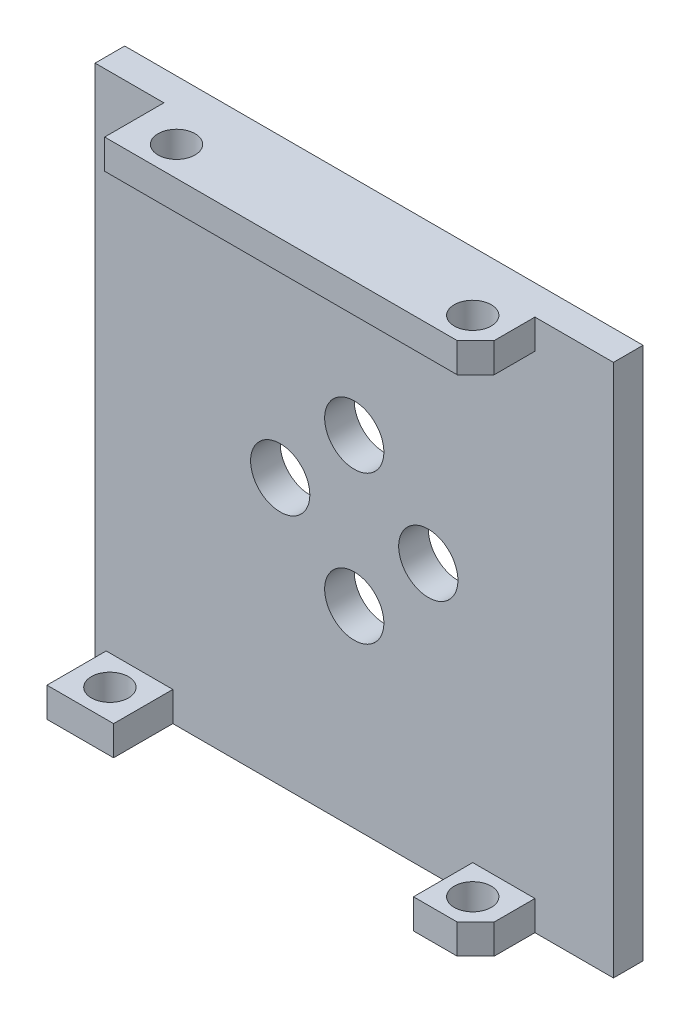
ISO-10303-21;
HEADER;
FILE_DESCRIPTION(('STEP AP214'),'2;1');
FILE_NAME('part.step','',(''),(''),'','','');
FILE_SCHEMA(('AUTOMOTIVE_DESIGN { 1 0 10303 214 1 1 1 1 }'));
ENDSEC;
DATA;
#1=APPLICATION_CONTEXT('core data for automotive mechanical design processes');
#2=APPLICATION_PROTOCOL_DEFINITION('international standard','automotive_design',2000,#1);
#3=PRODUCT_CONTEXT('',#1,'mechanical');
#4=PRODUCT('Part','Part','',(#3));
#5=PRODUCT_RELATED_PRODUCT_CATEGORY('part','',(#4));
#6=PRODUCT_DEFINITION_FORMATION('','',#4);
#7=PRODUCT_DEFINITION_CONTEXT('part definition',#1,'design');
#8=PRODUCT_DEFINITION('design','',#6,#7);
#9=PRODUCT_DEFINITION_SHAPE('','',#8);
#10=(LENGTH_UNIT() NAMED_UNIT(*) SI_UNIT(.MILLI.,.METRE.));
#11=(NAMED_UNIT(*) PLANE_ANGLE_UNIT() SI_UNIT($,.RADIAN.));
#12=(NAMED_UNIT(*) SI_UNIT($,.STERADIAN.) SOLID_ANGLE_UNIT());
#13=UNCERTAINTY_MEASURE_WITH_UNIT(LENGTH_MEASURE(1.E-05),#10,'distance_accuracy_value','');
#14=(GEOMETRIC_REPRESENTATION_CONTEXT(3) GLOBAL_UNCERTAINTY_ASSIGNED_CONTEXT((#13)) GLOBAL_UNIT_ASSIGNED_CONTEXT((#10,
#11,#12)) REPRESENTATION_CONTEXT('',''));
#15=CARTESIAN_POINT('',(0.,0.,0.));
#16=DIRECTION('',(0.,0.,1.));
#17=DIRECTION('',(1.,0.,0.));
#18=AXIS2_PLACEMENT_3D('',#15,#16,#17);
#19=CARTESIAN_POINT('',(0.,0.,2.));
#20=DIRECTION('',(0.,0.,1.));
#21=DIRECTION('',(1.,0.,0.));
#22=AXIS2_PLACEMENT_3D('',#19,#20,#21);
#23=PLANE('',#22);
#24=DIRECTION('',(0.,-1.,0.));
#25=VECTOR('',#24,1.);
#26=CARTESIAN_POINT('',(8.,-16.,2.));
#27=LINE('',#26,#25);
#28=CARTESIAN_POINT('',(8.,-16.,2.));
#29=VERTEX_POINT('',#28);
#30=CARTESIAN_POINT('',(8.,-18.,2.));
#31=VERTEX_POINT('',#30);
#32=EDGE_CURVE('E202',#29,#31,#27,.T.);
#33=ORIENTED_EDGE('',*,*,#32,.F.);
#34=DIRECTION('',(1.,0.,0.));
#35=VECTOR('',#34,1.);
#36=CARTESIAN_POINT('',(12.2,-16.,2.));
#37=LINE('',#36,#35);
#38=CARTESIAN_POINT('',(12.2,-16.,2.));
#39=VERTEX_POINT('',#38);
#40=EDGE_CURVE('E199',#29,#39,#37,.T.);
#41=ORIENTED_EDGE('',*,*,#40,.T.);
#42=DIRECTION('',(0.,-1.,0.));
#43=VECTOR('',#42,1.);
#44=CARTESIAN_POINT('',(12.2,-16.,2.));
#45=LINE('',#44,#43);
#46=CARTESIAN_POINT('',(12.2,-18.,2.));
#47=VERTEX_POINT('',#46);
#48=EDGE_CURVE('E210',#39,#47,#45,.T.);
#49=ORIENTED_EDGE('',*,*,#48,.T.);
#50=DIRECTION('',(1.,0.,0.));
#51=VECTOR('',#50,1.);
#52=CARTESIAN_POINT('',(-17.5,-18.,2.));
#53=LINE('',#52,#51);
#54=CARTESIAN_POINT('',(17.5,-18.,2.));
#55=VERTEX_POINT('',#54);
#56=EDGE_CURVE('E314',#47,#55,#53,.T.);
#57=ORIENTED_EDGE('',*,*,#56,.T.);
#58=DIRECTION('',(0.,1.,0.));
#59=VECTOR('',#58,1.);
#60=CARTESIAN_POINT('',(17.5,-18.,2.));
#61=LINE('',#60,#59);
#62=CARTESIAN_POINT('',(17.5,18.,2.));
#63=VERTEX_POINT('',#62);
#64=EDGE_CURVE('E315',#55,#63,#61,.T.);
#65=ORIENTED_EDGE('',*,*,#64,.T.);
#66=DIRECTION('',(-1.,0.,0.));
#67=VECTOR('',#66,1.);
#68=CARTESIAN_POINT('',(-17.5,18.,2.));
#69=LINE('',#68,#67);
#70=CARTESIAN_POINT('',(12.2,18.,2.));
#71=VERTEX_POINT('',#70);
#72=EDGE_CURVE('E320',#63,#71,#69,.T.);
#73=ORIENTED_EDGE('',*,*,#72,.T.);
#74=DIRECTION('',(0.,1.,0.));
#75=VECTOR('',#74,1.);
#76=CARTESIAN_POINT('',(12.2,0.,2.));
#77=LINE('',#76,#75);
#78=CARTESIAN_POINT('',(12.2,16.,2.));
#79=VERTEX_POINT('',#78);
#80=EDGE_CURVE('E344',#79,#71,#77,.T.);
#81=ORIENTED_EDGE('',*,*,#80,.F.);
#82=DIRECTION('',(-1.,0.,0.));
#83=VECTOR('',#82,1.);
#84=CARTESIAN_POINT('',(0.,16.,2.));
#85=LINE('',#84,#83);
#86=CARTESIAN_POINT('',(-12.8534545598179,16.,2.));
#87=VERTEX_POINT('',#86);
#88=EDGE_CURVE('E279',#79,#87,#85,.T.);
#89=ORIENTED_EDGE('',*,*,#88,.T.);
#90=DIRECTION('',(0.,-1.,0.));
#91=VECTOR('',#90,1.);
#92=CARTESIAN_POINT('',(-12.8534545598179,0.,2.));
#93=LINE('',#92,#91);
#94=CARTESIAN_POINT('',(-12.8534545598179,18.,2.));
#95=VERTEX_POINT('',#94);
#96=EDGE_CURVE('E345',#95,#87,#93,.T.);
#97=ORIENTED_EDGE('',*,*,#96,.F.);
#98=CARTESIAN_POINT('',(-17.5,18.,2.));
#99=VERTEX_POINT('',#98);
#100=EDGE_CURVE('E316',#95,#99,#69,.T.);
#101=ORIENTED_EDGE('',*,*,#100,.T.);
#102=DIRECTION('',(0.,-1.,0.));
#103=VECTOR('',#102,1.);
#104=CARTESIAN_POINT('',(-17.5,-18.,2.));
#105=LINE('',#104,#103);
#106=CARTESIAN_POINT('',(-17.5,-18.,2.));
#107=VERTEX_POINT('',#106);
#108=EDGE_CURVE('E319',#99,#107,#105,.T.);
#109=ORIENTED_EDGE('',*,*,#108,.T.);
#110=CARTESIAN_POINT('',(-16.75,-18.,2.));
#111=VERTEX_POINT('',#110);
#112=EDGE_CURVE('E309',#107,#111,#53,.T.);
#113=ORIENTED_EDGE('',*,*,#112,.T.);
#114=DIRECTION('',(0.,-1.,0.));
#115=VECTOR('',#114,1.);
#116=CARTESIAN_POINT('',(-16.75,0.,2.));
#117=LINE('',#116,#115);
#118=CARTESIAN_POINT('',(-16.75,-16.,2.));
#119=VERTEX_POINT('',#118);
#120=EDGE_CURVE('E11',#119,#111,#117,.T.);
#121=ORIENTED_EDGE('',*,*,#120,.F.);
#122=DIRECTION('',(-1.,0.,0.));
#123=VECTOR('',#122,1.);
#124=CARTESIAN_POINT('',(0.,-16.,2.));
#125=LINE('',#124,#123);
#126=CARTESIAN_POINT('',(-12.25,-16.,2.));
#127=VERTEX_POINT('',#126);
#128=EDGE_CURVE('E53',#127,#119,#125,.T.);
#129=ORIENTED_EDGE('',*,*,#128,.F.);
#130=DIRECTION('',(0.,1.,0.));
#131=VECTOR('',#130,1.);
#132=CARTESIAN_POINT('',(-12.25,0.,2.));
#133=LINE('',#132,#131);
#134=CARTESIAN_POINT('',(-12.25,-18.,2.));
#135=VERTEX_POINT('',#134);
#136=EDGE_CURVE('E50',#135,#127,#133,.T.);
#137=ORIENTED_EDGE('',*,*,#136,.F.);
#138=EDGE_CURVE('E311',#135,#31,#53,.T.);
#139=ORIENTED_EDGE('',*,*,#138,.T.);
#140=EDGE_LOOP('',(#33,#41,#49,#57,#65,#73,#81,#89,#97,#101,#109,#113,#121,#129,#137,#139));
#141=FACE_BOUND('',#140,.T.);
#142=CARTESIAN_POINT('',(5.,0.,2.));
#143=DIRECTION('',(0.,0.,1.));
#144=DIRECTION('',(1.,0.,0.));
#145=AXIS2_PLACEMENT_3D('',#142,#143,#144);
#146=CIRCLE('',#145,2.);
#147=CARTESIAN_POINT('',(7.,0.,2.));
#148=VERTEX_POINT('',#147);
#149=EDGE_CURVE('E295',#148,#148,#146,.T.);
#150=ORIENTED_EDGE('',*,*,#149,.F.);
#151=EDGE_LOOP('',(#150));
#152=FACE_BOUND('',#151,.T.);
#153=CARTESIAN_POINT('',(-5.,0.,2.));
#154=DIRECTION('',(0.,0.,1.));
#155=DIRECTION('',(1.,0.,0.));
#156=AXIS2_PLACEMENT_3D('',#153,#154,#155);
#157=CIRCLE('',#156,2.);
#158=CARTESIAN_POINT('',(-3.,0.,2.));
#159=VERTEX_POINT('',#158);
#160=EDGE_CURVE('E303',#159,#159,#157,.T.);
#161=ORIENTED_EDGE('',*,*,#160,.F.);
#162=EDGE_LOOP('',(#161));
#163=FACE_BOUND('',#162,.T.);
#164=CARTESIAN_POINT('',(0.,5.,2.));
#165=DIRECTION('',(0.,0.,1.));
#166=DIRECTION('',(1.,0.,0.));
#167=AXIS2_PLACEMENT_3D('',#164,#165,#166);
#168=CIRCLE('',#167,2.);
#169=CARTESIAN_POINT('',(2.00000000000002,5.,2.));
#170=VERTEX_POINT('',#169);
#171=EDGE_CURVE('E297',#170,#170,#168,.T.);
#172=ORIENTED_EDGE('',*,*,#171,.F.);
#173=EDGE_LOOP('',(#172));
#174=FACE_BOUND('',#173,.T.);
#175=CARTESIAN_POINT('',(0.,-5.,2.));
#176=DIRECTION('',(0.,0.,1.));
#177=DIRECTION('',(1.,0.,0.));
#178=AXIS2_PLACEMENT_3D('',#175,#176,#177);
#179=CIRCLE('',#178,2.);
#180=CARTESIAN_POINT('',(1.99999999999995,-5.,2.));
#181=VERTEX_POINT('',#180);
#182=EDGE_CURVE('E289',#181,#181,#179,.T.);
#183=ORIENTED_EDGE('',*,*,#182,.F.);
#184=EDGE_LOOP('',(#183));
#185=FACE_BOUND('',#184,.T.);
#186=ADVANCED_FACE('F39',(#141,#152,#163,#174,#185),#23,.T.);
#187=CARTESIAN_POINT('',(0.,0.,0.));
#188=DIRECTION('',(0.,0.,1.));
#189=DIRECTION('',(1.,0.,0.));
#190=AXIS2_PLACEMENT_3D('',#187,#188,#189);
#191=PLANE('',#190);
#192=DIRECTION('',(0.,1.,0.));
#193=VECTOR('',#192,1.);
#194=CARTESIAN_POINT('',(17.5,-18.,0.));
#195=LINE('',#194,#193);
#196=CARTESIAN_POINT('',(17.5,-18.,0.));
#197=VERTEX_POINT('',#196);
#198=CARTESIAN_POINT('',(17.5,18.,0.));
#199=VERTEX_POINT('',#198);
#200=EDGE_CURVE('E322',#197,#199,#195,.T.);
#201=ORIENTED_EDGE('',*,*,#200,.F.);
#202=DIRECTION('',(1.,0.,0.));
#203=VECTOR('',#202,1.);
#204=CARTESIAN_POINT('',(-17.5,-18.,0.));
#205=LINE('',#204,#203);
#206=CARTESIAN_POINT('',(-17.5,-18.,0.));
#207=VERTEX_POINT('',#206);
#208=EDGE_CURVE('E307',#207,#197,#205,.T.);
#209=ORIENTED_EDGE('',*,*,#208,.F.);
#210=DIRECTION('',(0.,-1.,0.));
#211=VECTOR('',#210,1.);
#212=CARTESIAN_POINT('',(-17.5,-18.,0.));
#213=LINE('',#212,#211);
#214=CARTESIAN_POINT('',(-17.5,18.,0.));
#215=VERTEX_POINT('',#214);
#216=EDGE_CURVE('E327',#215,#207,#213,.T.);
#217=ORIENTED_EDGE('',*,*,#216,.F.);
#218=DIRECTION('',(-1.,0.,0.));
#219=VECTOR('',#218,1.);
#220=CARTESIAN_POINT('',(-17.5,18.,0.));
#221=LINE('',#220,#219);
#222=EDGE_CURVE('E326',#199,#215,#221,.T.);
#223=ORIENTED_EDGE('',*,*,#222,.F.);
#224=EDGE_LOOP('',(#201,#209,#217,#223));
#225=FACE_BOUND('',#224,.T.);
#226=CARTESIAN_POINT('',(-5.,0.,0.));
#227=DIRECTION('',(0.,0.,1.));
#228=DIRECTION('',(1.,0.,0.));
#229=AXIS2_PLACEMENT_3D('',#226,#227,#228);
#230=CIRCLE('',#229,2.);
#231=CARTESIAN_POINT('',(-3.,0.,0.));
#232=VERTEX_POINT('',#231);
#233=EDGE_CURVE('E304',#232,#232,#230,.T.);
#234=ORIENTED_EDGE('',*,*,#233,.T.);
#235=EDGE_LOOP('',(#234));
#236=FACE_BOUND('',#235,.T.);
#237=CARTESIAN_POINT('',(0.,5.,0.));
#238=DIRECTION('',(0.,0.,1.));
#239=DIRECTION('',(1.,0.,0.));
#240=AXIS2_PLACEMENT_3D('',#237,#238,#239);
#241=CIRCLE('',#240,2.);
#242=CARTESIAN_POINT('',(2.00000000000002,5.,0.));
#243=VERTEX_POINT('',#242);
#244=EDGE_CURVE('E293',#243,#243,#241,.T.);
#245=ORIENTED_EDGE('',*,*,#244,.T.);
#246=EDGE_LOOP('',(#245));
#247=FACE_BOUND('',#246,.T.);
#248=CARTESIAN_POINT('',(5.,0.,0.));
#249=DIRECTION('',(0.,0.,1.));
#250=DIRECTION('',(1.,0.,0.));
#251=AXIS2_PLACEMENT_3D('',#248,#249,#250);
#252=CIRCLE('',#251,2.);
#253=CARTESIAN_POINT('',(7.,0.,0.));
#254=VERTEX_POINT('',#253);
#255=EDGE_CURVE('E288',#254,#254,#252,.T.);
#256=ORIENTED_EDGE('',*,*,#255,.T.);
#257=EDGE_LOOP('',(#256));
#258=FACE_BOUND('',#257,.T.);
#259=CARTESIAN_POINT('',(0.,-5.,0.));
#260=DIRECTION('',(0.,0.,1.));
#261=DIRECTION('',(1.,0.,0.));
#262=AXIS2_PLACEMENT_3D('',#259,#260,#261);
#263=CIRCLE('',#262,2.);
#264=CARTESIAN_POINT('',(1.99999999999995,-5.,0.));
#265=VERTEX_POINT('',#264);
#266=EDGE_CURVE('E281',#265,#265,#263,.T.);
#267=ORIENTED_EDGE('',*,*,#266,.T.);
#268=EDGE_LOOP('',(#267));
#269=FACE_BOUND('',#268,.T.);
#270=ADVANCED_FACE('F397',(#225,#236,#247,#258,#269),#191,.F.);
#271=CARTESIAN_POINT('',(-17.5,-18.,2.));
#272=DIRECTION('',(0.,1.,0.));
#273=DIRECTION('',(-1.,0.,0.));
#274=AXIS2_PLACEMENT_3D('',#271,#272,#273);
#275=PLANE('',#274);
#276=ORIENTED_EDGE('',*,*,#138,.F.);
#277=DIRECTION('',(0.,0.,1.));
#278=VECTOR('',#277,1.);
#279=CARTESIAN_POINT('',(-12.25,-18.,0.));
#280=LINE('',#279,#278);
#281=CARTESIAN_POINT('',(-12.25,-18.,6.));
#282=VERTEX_POINT('',#281);
#283=EDGE_CURVE('E195',#135,#282,#280,.T.);
#284=ORIENTED_EDGE('',*,*,#283,.T.);
#285=DIRECTION('',(-1.,0.,0.));
#286=VECTOR('',#285,1.);
#287=CARTESIAN_POINT('',(-16.75,-18.,6.));
#288=LINE('',#287,#286);
#289=CARTESIAN_POINT('',(-16.75,-18.,6.));
#290=VERTEX_POINT('',#289);
#291=EDGE_CURVE('E182',#282,#290,#288,.T.);
#292=ORIENTED_EDGE('',*,*,#291,.T.);
#293=DIRECTION('',(0.,0.,-1.));
#294=VECTOR('',#293,1.);
#295=CARTESIAN_POINT('',(-16.75,-18.,0.));
#296=LINE('',#295,#294);
#297=EDGE_CURVE('E186',#290,#111,#296,.T.);
#298=ORIENTED_EDGE('',*,*,#297,.T.);
#299=ORIENTED_EDGE('',*,*,#112,.F.);
#300=DIRECTION('',(0.,0.,-1.));
#301=VECTOR('',#300,1.);
#302=CARTESIAN_POINT('',(-17.5,-18.,2.));
#303=LINE('',#302,#301);
#304=EDGE_CURVE('E325',#107,#207,#303,.T.);
#305=ORIENTED_EDGE('',*,*,#304,.T.);
#306=ORIENTED_EDGE('',*,*,#208,.T.);
#307=DIRECTION('',(0.,0.,-1.));
#308=VECTOR('',#307,1.);
#309=CARTESIAN_POINT('',(17.5,-18.,2.));
#310=LINE('',#309,#308);
#311=EDGE_CURVE('E337',#55,#197,#310,.T.);
#312=ORIENTED_EDGE('',*,*,#311,.F.);
#313=ORIENTED_EDGE('',*,*,#56,.F.);
#314=DIRECTION('',(0.,0.,1.));
#315=VECTOR('',#314,1.);
#316=CARTESIAN_POINT('',(12.2,-18.,2.));
#317=LINE('',#316,#315);
#318=CARTESIAN_POINT('',(12.2,-18.,4.75));
#319=VERTEX_POINT('',#318);
#320=EDGE_CURVE('E218',#47,#319,#317,.T.);
#321=ORIENTED_EDGE('',*,*,#320,.T.);
#322=DIRECTION('',(-0.707106781186547,0.,0.707106781186547));
#323=VECTOR('',#322,1.);
#324=CARTESIAN_POINT('',(12.2,-18.,4.75));
#325=LINE('',#324,#323);
#326=CARTESIAN_POINT('',(10.95,-18.,6.));
#327=VERTEX_POINT('',#326);
#328=EDGE_CURVE('E216',#319,#327,#325,.T.);
#329=ORIENTED_EDGE('',*,*,#328,.T.);
#330=DIRECTION('',(-1.,0.,0.));
#331=VECTOR('',#330,1.);
#332=CARTESIAN_POINT('',(10.95,-18.,6.));
#333=LINE('',#332,#331);
#334=CARTESIAN_POINT('',(8.,-18.,6.));
#335=VERTEX_POINT('',#334);
#336=EDGE_CURVE('E213',#327,#335,#333,.T.);
#337=ORIENTED_EDGE('',*,*,#336,.T.);
#338=DIRECTION('',(0.,0.,-1.));
#339=VECTOR('',#338,1.);
#340=CARTESIAN_POINT('',(8.,-18.,2.));
#341=LINE('',#340,#339);
#342=EDGE_CURVE('E209',#335,#31,#341,.T.);
#343=ORIENTED_EDGE('',*,*,#342,.T.);
#344=EDGE_LOOP('',(#276,#284,#292,#298,#299,#305,#306,#312,#313,#321,#329,#337,#343));
#345=FACE_BOUND('',#344,.T.);
#346=CARTESIAN_POINT('',(-14.5,-18.,4.));
#347=DIRECTION('',(0.,-1.,0.));
#348=DIRECTION('',(1.,0.,0.));
#349=AXIS2_PLACEMENT_3D('',#346,#347,#348);
#350=CIRCLE('',#349,1.25140183000913);
#351=CARTESIAN_POINT('',(-13.2485981699909,-18.,4.));
#352=VERTEX_POINT('',#351);
#353=EDGE_CURVE('E240',#352,#352,#350,.T.);
#354=ORIENTED_EDGE('',*,*,#353,.F.);
#355=EDGE_LOOP('',(#354));
#356=FACE_BOUND('',#355,.T.);
#357=CARTESIAN_POINT('',(10.,-18.,4.));
#358=DIRECTION('',(0.,-1.,0.));
#359=DIRECTION('',(1.,0.,0.));
#360=AXIS2_PLACEMENT_3D('',#357,#358,#359);
#361=CIRCLE('',#360,1.25);
#362=CARTESIAN_POINT('',(11.25,-18.,4.));
#363=VERTEX_POINT('',#362);
#364=EDGE_CURVE('E233',#363,#363,#361,.T.);
#365=ORIENTED_EDGE('',*,*,#364,.F.);
#366=EDGE_LOOP('',(#365));
#367=FACE_BOUND('',#366,.T.);
#368=ADVANCED_FACE('F41',(#345,#356,#367),#275,.F.);
#369=CARTESIAN_POINT('',(17.5,-18.,2.));
#370=DIRECTION('',(-1.,0.,0.));
#371=DIRECTION('',(0.,0.,1.));
#372=AXIS2_PLACEMENT_3D('',#369,#370,#371);
#373=PLANE('',#372);
#374=ORIENTED_EDGE('',*,*,#200,.T.);
#375=DIRECTION('',(0.,0.,-1.));
#376=VECTOR('',#375,1.);
#377=CARTESIAN_POINT('',(17.5,18.,2.));
#378=LINE('',#377,#376);
#379=EDGE_CURVE('E333',#63,#199,#378,.T.);
#380=ORIENTED_EDGE('',*,*,#379,.F.);
#381=ORIENTED_EDGE('',*,*,#64,.F.);
#382=ORIENTED_EDGE('',*,*,#311,.T.);
#383=EDGE_LOOP('',(#374,#380,#381,#382));
#384=FACE_BOUND('',#383,.T.);
#385=ADVANCED_FACE('F398',(#384),#373,.F.);
#386=CARTESIAN_POINT('',(-17.5,18.,2.));
#387=DIRECTION('',(0.,-1.,0.));
#388=DIRECTION('',(1.,0.,0.));
#389=AXIS2_PLACEMENT_3D('',#386,#387,#388);
#390=PLANE('',#389);
#391=ORIENTED_EDGE('',*,*,#222,.T.);
#392=DIRECTION('',(0.,0.,-1.));
#393=VECTOR('',#392,1.);
#394=CARTESIAN_POINT('',(-17.5,18.,2.));
#395=LINE('',#394,#393);
#396=EDGE_CURVE('E335',#99,#215,#395,.T.);
#397=ORIENTED_EDGE('',*,*,#396,.F.);
#398=ORIENTED_EDGE('',*,*,#100,.F.);
#399=DIRECTION('',(0.,0.,1.));
#400=VECTOR('',#399,1.);
#401=CARTESIAN_POINT('',(-12.8534545598179,18.,6.));
#402=LINE('',#401,#400);
#403=CARTESIAN_POINT('',(-12.8534545598179,18.,6.));
#404=VERTEX_POINT('',#403);
#405=EDGE_CURVE('E253',#95,#404,#402,.T.);
#406=ORIENTED_EDGE('',*,*,#405,.T.);
#407=DIRECTION('',(1.,0.,0.));
#408=VECTOR('',#407,1.);
#409=CARTESIAN_POINT('',(10.95,18.,6.));
#410=LINE('',#409,#408);
#411=CARTESIAN_POINT('',(10.95,18.,6.));
#412=VERTEX_POINT('',#411);
#413=EDGE_CURVE('E268',#404,#412,#410,.T.);
#414=ORIENTED_EDGE('',*,*,#413,.T.);
#415=DIRECTION('',(0.707106781186547,0.,-0.707106781186548));
#416=VECTOR('',#415,1.);
#417=CARTESIAN_POINT('',(12.2,18.,4.75));
#418=LINE('',#417,#416);
#419=CARTESIAN_POINT('',(12.2,18.,4.75));
#420=VERTEX_POINT('',#419);
#421=EDGE_CURVE('E271',#412,#420,#418,.T.);
#422=ORIENTED_EDGE('',*,*,#421,.T.);
#423=DIRECTION('',(0.,0.,-1.));
#424=VECTOR('',#423,1.);
#425=CARTESIAN_POINT('',(12.2,18.,4.75));
#426=LINE('',#425,#424);
#427=EDGE_CURVE('E260',#420,#71,#426,.T.);
#428=ORIENTED_EDGE('',*,*,#427,.T.);
#429=ORIENTED_EDGE('',*,*,#72,.F.);
#430=ORIENTED_EDGE('',*,*,#379,.T.);
#431=EDGE_LOOP('',(#391,#397,#398,#406,#414,#422,#428,#429,#430));
#432=FACE_BOUND('',#431,.T.);
#433=CARTESIAN_POINT('',(-10.,18.,4.));
#434=DIRECTION('',(0.,1.,0.));
#435=DIRECTION('',(1.,0.,0.));
#436=AXIS2_PLACEMENT_3D('',#433,#434,#435);
#437=CIRCLE('',#436,1.25);
#438=CARTESIAN_POINT('',(-8.75,18.,4.));
#439=VERTEX_POINT('',#438);
#440=EDGE_CURVE('E243',#439,#439,#437,.T.);
#441=ORIENTED_EDGE('',*,*,#440,.F.);
#442=EDGE_LOOP('',(#441));
#443=FACE_BOUND('',#442,.T.);
#444=CARTESIAN_POINT('',(10.,18.,4.));
#445=DIRECTION('',(0.,1.,0.));
#446=DIRECTION('',(-1.,0.,0.));
#447=AXIS2_PLACEMENT_3D('',#444,#445,#446);
#448=CIRCLE('',#447,1.25);
#449=CARTESIAN_POINT('',(8.75,18.,4.));
#450=VERTEX_POINT('',#449);
#451=EDGE_CURVE('E241',#450,#450,#448,.T.);
#452=ORIENTED_EDGE('',*,*,#451,.F.);
#453=EDGE_LOOP('',(#452));
#454=FACE_BOUND('',#453,.T.);
#455=ADVANCED_FACE('F369',(#432,#443,#454),#390,.F.);
#456=CARTESIAN_POINT('',(-17.5,-18.,2.));
#457=DIRECTION('',(1.,0.,0.));
#458=DIRECTION('',(0.,0.,-1.));
#459=AXIS2_PLACEMENT_3D('',#456,#457,#458);
#460=PLANE('',#459);
#461=ORIENTED_EDGE('',*,*,#216,.T.);
#462=ORIENTED_EDGE('',*,*,#304,.F.);
#463=ORIENTED_EDGE('',*,*,#108,.F.);
#464=ORIENTED_EDGE('',*,*,#396,.T.);
#465=EDGE_LOOP('',(#461,#462,#463,#464));
#466=FACE_BOUND('',#465,.T.);
#467=ADVANCED_FACE('F376',(#466),#460,.F.);
#468=CARTESIAN_POINT('',(-5.,0.,2.));
#469=DIRECTION('',(0.,0.,-1.));
#470=DIRECTION('',(-1.,0.,0.));
#471=AXIS2_PLACEMENT_3D('',#468,#469,#470);
#472=CYLINDRICAL_SURFACE('',#471,2.);
#473=ORIENTED_EDGE('',*,*,#160,.T.);
#474=EDGE_LOOP('',(#473));
#475=FACE_BOUND('',#474,.T.);
#476=ORIENTED_EDGE('',*,*,#233,.F.);
#477=EDGE_LOOP('',(#476));
#478=FACE_BOUND('',#477,.T.);
#479=ADVANCED_FACE('F430',(#475,#478),#472,.F.);
#480=CARTESIAN_POINT('',(0.,5.,2.));
#481=DIRECTION('',(0.,0.,-1.));
#482=DIRECTION('',(-1.,0.,0.));
#483=AXIS2_PLACEMENT_3D('',#480,#481,#482);
#484=CYLINDRICAL_SURFACE('',#483,2.);
#485=ORIENTED_EDGE('',*,*,#171,.T.);
#486=EDGE_LOOP('',(#485));
#487=FACE_BOUND('',#486,.T.);
#488=ORIENTED_EDGE('',*,*,#244,.F.);
#489=EDGE_LOOP('',(#488));
#490=FACE_BOUND('',#489,.T.);
#491=ADVANCED_FACE('F597',(#487,#490),#484,.F.);
#492=CARTESIAN_POINT('',(5.,0.,2.));
#493=DIRECTION('',(0.,0.,-1.));
#494=DIRECTION('',(-1.,0.,0.));
#495=AXIS2_PLACEMENT_3D('',#492,#493,#494);
#496=CYLINDRICAL_SURFACE('',#495,2.);
#497=ORIENTED_EDGE('',*,*,#149,.T.);
#498=EDGE_LOOP('',(#497));
#499=FACE_BOUND('',#498,.T.);
#500=ORIENTED_EDGE('',*,*,#255,.F.);
#501=EDGE_LOOP('',(#500));
#502=FACE_BOUND('',#501,.T.);
#503=ADVANCED_FACE('F587',(#499,#502),#496,.F.);
#504=CARTESIAN_POINT('',(0.,-5.,2.));
#505=DIRECTION('',(0.,0.,-1.));
#506=DIRECTION('',(-1.,0.,0.));
#507=AXIS2_PLACEMENT_3D('',#504,#505,#506);
#508=CYLINDRICAL_SURFACE('',#507,2.);
#509=ORIENTED_EDGE('',*,*,#182,.T.);
#510=EDGE_LOOP('',(#509));
#511=FACE_BOUND('',#510,.T.);
#512=ORIENTED_EDGE('',*,*,#266,.F.);
#513=EDGE_LOOP('',(#512));
#514=FACE_BOUND('',#513,.T.);
#515=ADVANCED_FACE('F583',(#511,#514),#508,.F.);
#516=CARTESIAN_POINT('',(-12.8534545598179,16.,6.));
#517=DIRECTION('',(-1.,0.,0.));
#518=DIRECTION('',(0.,-1.,0.));
#519=AXIS2_PLACEMENT_3D('',#516,#517,#518);
#520=PLANE('',#519);
#521=ORIENTED_EDGE('',*,*,#405,.F.);
#522=ORIENTED_EDGE('',*,*,#96,.T.);
#523=DIRECTION('',(0.,0.,1.));
#524=VECTOR('',#523,1.);
#525=CARTESIAN_POINT('',(-12.8534545598179,16.,6.));
#526=LINE('',#525,#524);
#527=CARTESIAN_POINT('',(-12.8534545598179,16.,6.));
#528=VERTEX_POINT('',#527);
#529=EDGE_CURVE('E255',#87,#528,#526,.T.);
#530=ORIENTED_EDGE('',*,*,#529,.T.);
#531=DIRECTION('',(0.,1.,0.));
#532=VECTOR('',#531,1.);
#533=CARTESIAN_POINT('',(-12.8534545598179,16.,6.));
#534=LINE('',#533,#532);
#535=EDGE_CURVE('E266',#528,#404,#534,.T.);
#536=ORIENTED_EDGE('',*,*,#535,.T.);
#537=EDGE_LOOP('',(#521,#522,#530,#536));
#538=FACE_BOUND('',#537,.T.);
#539=ADVANCED_FACE('F350',(#538),#520,.T.);
#540=CARTESIAN_POINT('',(12.2,16.,4.75));
#541=DIRECTION('',(1.,0.,0.));
#542=DIRECTION('',(0.,1.,0.));
#543=AXIS2_PLACEMENT_3D('',#540,#541,#542);
#544=PLANE('',#543);
#545=DIRECTION('',(0.,0.,-1.));
#546=VECTOR('',#545,1.);
#547=CARTESIAN_POINT('',(12.2,16.,4.75));
#548=LINE('',#547,#546);
#549=CARTESIAN_POINT('',(12.2,16.,4.75));
#550=VERTEX_POINT('',#549);
#551=EDGE_CURVE('E263',#550,#79,#548,.T.);
#552=ORIENTED_EDGE('',*,*,#551,.T.);
#553=ORIENTED_EDGE('',*,*,#80,.T.);
#554=ORIENTED_EDGE('',*,*,#427,.F.);
#555=DIRECTION('',(0.,1.,0.));
#556=VECTOR('',#555,1.);
#557=CARTESIAN_POINT('',(12.2,16.,4.75));
#558=LINE('',#557,#556);
#559=EDGE_CURVE('E277',#550,#420,#558,.T.);
#560=ORIENTED_EDGE('',*,*,#559,.F.);
#561=EDGE_LOOP('',(#552,#553,#554,#560));
#562=FACE_BOUND('',#561,.T.);
#563=ADVANCED_FACE('F357',(#562),#544,.T.);
#564=CARTESIAN_POINT('',(12.2,16.,4.75));
#565=DIRECTION('',(0.707106781186548,0.,0.707106781186547));
#566=DIRECTION('',(0.707106781186547,0.,-0.707106781186548));
#567=AXIS2_PLACEMENT_3D('',#564,#565,#566);
#568=PLANE('',#567);
#569=ORIENTED_EDGE('',*,*,#421,.F.);
#570=DIRECTION('',(0.,1.,0.));
#571=VECTOR('',#570,1.);
#572=CARTESIAN_POINT('',(10.95,16.,6.));
#573=LINE('',#572,#571);
#574=CARTESIAN_POINT('',(10.95,16.,6.));
#575=VERTEX_POINT('',#574);
#576=EDGE_CURVE('E276',#575,#412,#573,.T.);
#577=ORIENTED_EDGE('',*,*,#576,.F.);
#578=DIRECTION('',(0.707106781186547,0.,-0.707106781186548));
#579=VECTOR('',#578,1.);
#580=CARTESIAN_POINT('',(12.2,16.,4.75));
#581=LINE('',#580,#579);
#582=EDGE_CURVE('E257',#575,#550,#581,.T.);
#583=ORIENTED_EDGE('',*,*,#582,.T.);
#584=ORIENTED_EDGE('',*,*,#559,.T.);
#585=EDGE_LOOP('',(#569,#577,#583,#584));
#586=FACE_BOUND('',#585,.T.);
#587=ADVANCED_FACE('F365',(#586),#568,.T.);
#588=CARTESIAN_POINT('',(10.95,16.,6.));
#589=DIRECTION('',(0.,0.,1.));
#590=DIRECTION('',(1.,0.,0.));
#591=AXIS2_PLACEMENT_3D('',#588,#589,#590);
#592=PLANE('',#591);
#593=ORIENTED_EDGE('',*,*,#413,.F.);
#594=ORIENTED_EDGE('',*,*,#535,.F.);
#595=DIRECTION('',(1.,0.,0.));
#596=VECTOR('',#595,1.);
#597=CARTESIAN_POINT('',(10.95,16.,6.));
#598=LINE('',#597,#596);
#599=EDGE_CURVE('E258',#528,#575,#598,.T.);
#600=ORIENTED_EDGE('',*,*,#599,.T.);
#601=ORIENTED_EDGE('',*,*,#576,.T.);
#602=EDGE_LOOP('',(#593,#594,#600,#601));
#603=FACE_BOUND('',#602,.T.);
#604=ADVANCED_FACE('F370',(#603),#592,.T.);
#605=CARTESIAN_POINT('',(0.,16.,0.));
#606=DIRECTION('',(0.,1.,0.));
#607=DIRECTION('',(-1.,0.,0.));
#608=AXIS2_PLACEMENT_3D('',#605,#606,#607);
#609=PLANE('',#608);
#610=ORIENTED_EDGE('',*,*,#88,.F.);
#611=ORIENTED_EDGE('',*,*,#551,.F.);
#612=ORIENTED_EDGE('',*,*,#582,.F.);
#613=ORIENTED_EDGE('',*,*,#599,.F.);
#614=ORIENTED_EDGE('',*,*,#529,.F.);
#615=EDGE_LOOP('',(#610,#611,#612,#613,#614));
#616=FACE_BOUND('',#615,.T.);
#617=CARTESIAN_POINT('',(-10.,16.,4.));
#618=DIRECTION('',(0.,1.,0.));
#619=DIRECTION('',(1.,0.,0.));
#620=AXIS2_PLACEMENT_3D('',#617,#618,#619);
#621=CIRCLE('',#620,1.25);
#622=CARTESIAN_POINT('',(-8.75,16.,4.));
#623=VERTEX_POINT('',#622);
#624=EDGE_CURVE('E244',#623,#623,#621,.T.);
#625=ORIENTED_EDGE('',*,*,#624,.T.);
#626=EDGE_LOOP('',(#625));
#627=FACE_BOUND('',#626,.T.);
#628=CARTESIAN_POINT('',(10.,16.,4.));
#629=DIRECTION('',(0.,1.,0.));
#630=DIRECTION('',(-1.,0.,0.));
#631=AXIS2_PLACEMENT_3D('',#628,#629,#630);
#632=CIRCLE('',#631,1.25);
#633=CARTESIAN_POINT('',(8.75,16.,4.));
#634=VERTEX_POINT('',#633);
#635=EDGE_CURVE('E250',#634,#634,#632,.T.);
#636=ORIENTED_EDGE('',*,*,#635,.T.);
#637=EDGE_LOOP('',(#636));
#638=FACE_BOUND('',#637,.T.);
#639=ADVANCED_FACE('F351',(#616,#627,#638),#609,.F.);
#640=CARTESIAN_POINT('',(10.,16.,4.));
#641=DIRECTION('',(0.,1.,0.));
#642=DIRECTION('',(-1.,0.,0.));
#643=AXIS2_PLACEMENT_3D('',#640,#641,#642);
#644=CYLINDRICAL_SURFACE('',#643,1.25);
#645=ORIENTED_EDGE('',*,*,#635,.F.);
#646=EDGE_LOOP('',(#645));
#647=FACE_BOUND('',#646,.T.);
#648=ORIENTED_EDGE('',*,*,#451,.T.);
#649=EDGE_LOOP('',(#648));
#650=FACE_BOUND('',#649,.T.);
#651=ADVANCED_FACE('F536',(#647,#650),#644,.F.);
#652=CARTESIAN_POINT('',(-10.,16.,4.));
#653=DIRECTION('',(0.,1.,0.));
#654=DIRECTION('',(-1.,0.,0.));
#655=AXIS2_PLACEMENT_3D('',#652,#653,#654);
#656=CYLINDRICAL_SURFACE('',#655,1.25);
#657=ORIENTED_EDGE('',*,*,#624,.F.);
#658=EDGE_LOOP('',(#657));
#659=FACE_BOUND('',#658,.T.);
#660=ORIENTED_EDGE('',*,*,#440,.T.);
#661=EDGE_LOOP('',(#660));
#662=FACE_BOUND('',#661,.T.);
#663=ADVANCED_FACE('F470',(#659,#662),#656,.F.);
#664=CARTESIAN_POINT('',(12.2,-16.,2.));
#665=DIRECTION('',(1.,0.,0.));
#666=DIRECTION('',(0.,1.,0.));
#667=AXIS2_PLACEMENT_3D('',#664,#665,#666);
#668=PLANE('',#667);
#669=ORIENTED_EDGE('',*,*,#320,.F.);
#670=ORIENTED_EDGE('',*,*,#48,.F.);
#671=DIRECTION('',(0.,0.,1.));
#672=VECTOR('',#671,1.);
#673=CARTESIAN_POINT('',(12.2,-16.,2.));
#674=LINE('',#673,#672);
#675=CARTESIAN_POINT('',(12.2,-16.,4.75));
#676=VERTEX_POINT('',#675);
#677=EDGE_CURVE('E64',#39,#676,#674,.T.);
#678=ORIENTED_EDGE('',*,*,#677,.T.);
#679=DIRECTION('',(0.,-1.,0.));
#680=VECTOR('',#679,1.);
#681=CARTESIAN_POINT('',(12.2,-16.,4.75));
#682=LINE('',#681,#680);
#683=EDGE_CURVE('E196',#676,#319,#682,.T.);
#684=ORIENTED_EDGE('',*,*,#683,.T.);
#685=EDGE_LOOP('',(#669,#670,#678,#684));
#686=FACE_BOUND('',#685,.T.);
#687=ADVANCED_FACE('F455',(#686),#668,.T.);
#688=CARTESIAN_POINT('',(8.,-16.,2.));
#689=DIRECTION('',(-1.,0.,0.));
#690=DIRECTION('',(0.,0.,1.));
#691=AXIS2_PLACEMENT_3D('',#688,#689,#690);
#692=PLANE('',#691);
#693=ORIENTED_EDGE('',*,*,#342,.F.);
#694=DIRECTION('',(0.,-1.,0.));
#695=VECTOR('',#694,1.);
#696=CARTESIAN_POINT('',(8.,-16.,6.));
#697=LINE('',#696,#695);
#698=CARTESIAN_POINT('',(8.,-16.,6.));
#699=VERTEX_POINT('',#698);
#700=EDGE_CURVE('E201',#699,#335,#697,.T.);
#701=ORIENTED_EDGE('',*,*,#700,.F.);
#702=DIRECTION('',(0.,0.,-1.));
#703=VECTOR('',#702,1.);
#704=CARTESIAN_POINT('',(8.,-16.,2.));
#705=LINE('',#704,#703);
#706=EDGE_CURVE('E223',#699,#29,#705,.T.);
#707=ORIENTED_EDGE('',*,*,#706,.T.);
#708=ORIENTED_EDGE('',*,*,#32,.T.);
#709=EDGE_LOOP('',(#693,#701,#707,#708));
#710=FACE_BOUND('',#709,.T.);
#711=ADVANCED_FACE('F450',(#710),#692,.T.);
#712=CARTESIAN_POINT('',(10.95,-16.,6.));
#713=DIRECTION('',(0.,0.,1.));
#714=DIRECTION('',(1.,0.,0.));
#715=AXIS2_PLACEMENT_3D('',#712,#713,#714);
#716=PLANE('',#715);
#717=ORIENTED_EDGE('',*,*,#336,.F.);
#718=DIRECTION('',(0.,-1.,0.));
#719=VECTOR('',#718,1.);
#720=CARTESIAN_POINT('',(10.95,-16.,6.));
#721=LINE('',#720,#719);
#722=CARTESIAN_POINT('',(10.95,-16.,6.));
#723=VERTEX_POINT('',#722);
#724=EDGE_CURVE('E203',#723,#327,#721,.T.);
#725=ORIENTED_EDGE('',*,*,#724,.F.);
#726=DIRECTION('',(-1.,0.,0.));
#727=VECTOR('',#726,1.);
#728=CARTESIAN_POINT('',(10.95,-16.,6.));
#729=LINE('',#728,#727);
#730=EDGE_CURVE('E229',#723,#699,#729,.T.);
#731=ORIENTED_EDGE('',*,*,#730,.T.);
#732=ORIENTED_EDGE('',*,*,#700,.T.);
#733=EDGE_LOOP('',(#717,#725,#731,#732));
#734=FACE_BOUND('',#733,.T.);
#735=ADVANCED_FACE('F460',(#734),#716,.T.);
#736=CARTESIAN_POINT('',(12.2,-16.,4.75));
#737=DIRECTION('',(0.707106781186547,0.,0.707106781186547));
#738=DIRECTION('',(0.707106781186548,0.,-0.707106781186548));
#739=AXIS2_PLACEMENT_3D('',#736,#737,#738);
#740=PLANE('',#739);
#741=ORIENTED_EDGE('',*,*,#328,.F.);
#742=ORIENTED_EDGE('',*,*,#683,.F.);
#743=DIRECTION('',(-0.707106781186547,0.,0.707106781186547));
#744=VECTOR('',#743,1.);
#745=CARTESIAN_POINT('',(12.2,-16.,4.75));
#746=LINE('',#745,#744);
#747=EDGE_CURVE('E226',#676,#723,#746,.T.);
#748=ORIENTED_EDGE('',*,*,#747,.T.);
#749=ORIENTED_EDGE('',*,*,#724,.T.);
#750=EDGE_LOOP('',(#741,#742,#748,#749));
#751=FACE_BOUND('',#750,.T.);
#752=ADVANCED_FACE('F415',(#751),#740,.T.);
#753=CARTESIAN_POINT('',(0.,-16.,0.));
#754=DIRECTION('',(0.,-1.,0.));
#755=DIRECTION('',(0.,0.,-1.));
#756=AXIS2_PLACEMENT_3D('',#753,#754,#755);
#757=PLANE('',#756);
#758=CARTESIAN_POINT('',(10.,-16.,4.));
#759=DIRECTION('',(0.,-1.,0.));
#760=DIRECTION('',(1.,0.,0.));
#761=AXIS2_PLACEMENT_3D('',#758,#759,#760);
#762=CIRCLE('',#761,1.25);
#763=CARTESIAN_POINT('',(11.25,-16.,4.));
#764=VERTEX_POINT('',#763);
#765=EDGE_CURVE('E225',#764,#764,#762,.T.);
#766=ORIENTED_EDGE('',*,*,#765,.T.);
#767=EDGE_LOOP('',(#766));
#768=FACE_BOUND('',#767,.T.);
#769=ORIENTED_EDGE('',*,*,#677,.F.);
#770=ORIENTED_EDGE('',*,*,#40,.F.);
#771=ORIENTED_EDGE('',*,*,#706,.F.);
#772=ORIENTED_EDGE('',*,*,#730,.F.);
#773=ORIENTED_EDGE('',*,*,#747,.F.);
#774=EDGE_LOOP('',(#769,#770,#771,#772,#773));
#775=FACE_BOUND('',#774,.T.);
#776=ADVANCED_FACE('F403',(#768,#775),#757,.F.);
#777=CARTESIAN_POINT('',(10.,-16.,4.));
#778=DIRECTION('',(0.,-1.,0.));
#779=DIRECTION('',(1.,0.,0.));
#780=AXIS2_PLACEMENT_3D('',#777,#778,#779);
#781=CYLINDRICAL_SURFACE('',#780,1.25);
#782=ORIENTED_EDGE('',*,*,#765,.F.);
#783=EDGE_LOOP('',(#782));
#784=FACE_BOUND('',#783,.T.);
#785=ORIENTED_EDGE('',*,*,#364,.T.);
#786=EDGE_LOOP('',(#785));
#787=FACE_BOUND('',#786,.T.);
#788=ADVANCED_FACE('F401',(#784,#787),#781,.F.);
#789=CARTESIAN_POINT('',(-16.75,-16.,0.));
#790=DIRECTION('',(-1.,0.,0.));
#791=DIRECTION('',(0.,-1.,0.));
#792=AXIS2_PLACEMENT_3D('',#789,#790,#791);
#793=PLANE('',#792);
#794=DIRECTION('',(0.,0.,-1.));
#795=VECTOR('',#794,1.);
#796=CARTESIAN_POINT('',(-16.75,-16.,0.));
#797=LINE('',#796,#795);
#798=CARTESIAN_POINT('',(-16.75,-16.,6.));
#799=VERTEX_POINT('',#798);
#800=EDGE_CURVE('E171',#799,#119,#797,.T.);
#801=ORIENTED_EDGE('',*,*,#800,.T.);
#802=ORIENTED_EDGE('',*,*,#120,.T.);
#803=ORIENTED_EDGE('',*,*,#297,.F.);
#804=DIRECTION('',(0.,-1.,0.));
#805=VECTOR('',#804,1.);
#806=CARTESIAN_POINT('',(-16.75,-16.,6.));
#807=LINE('',#806,#805);
#808=EDGE_CURVE('E185',#799,#290,#807,.T.);
#809=ORIENTED_EDGE('',*,*,#808,.F.);
#810=EDGE_LOOP('',(#801,#802,#803,#809));
#811=FACE_BOUND('',#810,.T.);
#812=ADVANCED_FACE('F383',(#811),#793,.T.);
#813=CARTESIAN_POINT('',(-16.75,-16.,6.));
#814=DIRECTION('',(0.,0.,1.));
#815=DIRECTION('',(1.,0.,0.));
#816=AXIS2_PLACEMENT_3D('',#813,#814,#815);
#817=PLANE('',#816);
#818=ORIENTED_EDGE('',*,*,#291,.F.);
#819=DIRECTION('',(0.,-1.,0.));
#820=VECTOR('',#819,1.);
#821=CARTESIAN_POINT('',(-12.25,-16.,6.));
#822=LINE('',#821,#820);
#823=CARTESIAN_POINT('',(-12.25,-16.,6.));
#824=VERTEX_POINT('',#823);
#825=EDGE_CURVE('E168',#824,#282,#822,.T.);
#826=ORIENTED_EDGE('',*,*,#825,.F.);
#827=DIRECTION('',(-1.,0.,0.));
#828=VECTOR('',#827,1.);
#829=CARTESIAN_POINT('',(-16.75,-16.,6.));
#830=LINE('',#829,#828);
#831=EDGE_CURVE('E175',#824,#799,#830,.T.);
#832=ORIENTED_EDGE('',*,*,#831,.T.);
#833=ORIENTED_EDGE('',*,*,#808,.T.);
#834=EDGE_LOOP('',(#818,#826,#832,#833));
#835=FACE_BOUND('',#834,.T.);
#836=ADVANCED_FACE('F178',(#835),#817,.T.);
#837=CARTESIAN_POINT('',(-12.25,-16.,0.));
#838=DIRECTION('',(1.,0.,0.));
#839=DIRECTION('',(0.,1.,0.));
#840=AXIS2_PLACEMENT_3D('',#837,#838,#839);
#841=PLANE('',#840);
#842=ORIENTED_EDGE('',*,*,#283,.F.);
#843=ORIENTED_EDGE('',*,*,#136,.T.);
#844=DIRECTION('',(0.,0.,1.));
#845=VECTOR('',#844,1.);
#846=CARTESIAN_POINT('',(-12.25,-16.,0.));
#847=LINE('',#846,#845);
#848=EDGE_CURVE('E167',#127,#824,#847,.T.);
#849=ORIENTED_EDGE('',*,*,#848,.T.);
#850=ORIENTED_EDGE('',*,*,#825,.T.);
#851=EDGE_LOOP('',(#842,#843,#849,#850));
#852=FACE_BOUND('',#851,.T.);
#853=ADVANCED_FACE('F166',(#852),#841,.T.);
#854=CARTESIAN_POINT('',(0.,-16.,0.));
#855=DIRECTION('',(0.,1.,0.));
#856=DIRECTION('',(0.,0.,1.));
#857=AXIS2_PLACEMENT_3D('',#854,#855,#856);
#858=PLANE('',#857);
#859=CARTESIAN_POINT('',(-14.5,-16.,4.));
#860=DIRECTION('',(0.,-1.,0.));
#861=DIRECTION('',(1.,0.,0.));
#862=AXIS2_PLACEMENT_3D('',#859,#860,#861);
#863=CIRCLE('',#862,1.25140183000913);
#864=CARTESIAN_POINT('',(-13.2485981699909,-16.,4.));
#865=VERTEX_POINT('',#864);
#866=EDGE_CURVE('E193',#865,#865,#863,.T.);
#867=ORIENTED_EDGE('',*,*,#866,.T.);
#868=EDGE_LOOP('',(#867));
#869=FACE_BOUND('',#868,.T.);
#870=ORIENTED_EDGE('',*,*,#848,.F.);
#871=ORIENTED_EDGE('',*,*,#128,.T.);
#872=ORIENTED_EDGE('',*,*,#800,.F.);
#873=ORIENTED_EDGE('',*,*,#831,.F.);
#874=EDGE_LOOP('',(#870,#871,#872,#873));
#875=FACE_BOUND('',#874,.T.);
#876=ADVANCED_FACE('F183',(#869,#875),#858,.T.);
#877=CARTESIAN_POINT('',(-14.5,-16.,4.));
#878=DIRECTION('',(0.,-1.,0.));
#879=DIRECTION('',(1.,0.,0.));
#880=AXIS2_PLACEMENT_3D('',#877,#878,#879);
#881=CYLINDRICAL_SURFACE('',#880,1.25140183000913);
#882=ORIENTED_EDGE('',*,*,#866,.F.);
#883=EDGE_LOOP('',(#882));
#884=FACE_BOUND('',#883,.T.);
#885=ORIENTED_EDGE('',*,*,#353,.T.);
#886=EDGE_LOOP('',(#885));
#887=FACE_BOUND('',#886,.T.);
#888=ADVANCED_FACE('F394',(#884,#887),#881,.F.);
#889=CLOSED_SHELL('',(#186,#270,#368,#385,#455,#467,#479,#491,#503,#515,#539,#563,#587,#604,
#639,#651,#663,#687,#711,#735,#752,#776,#788,#812,#836,#853,#876,#888));
#890=MANIFOLD_SOLID_BREP('B2',#889);
#891=ADVANCED_BREP_SHAPE_REPRESENTATION('',(#18,#890),#14);
#892=SHAPE_DEFINITION_REPRESENTATION(#9,#891);
ENDSEC;
END-ISO-10303-21;
